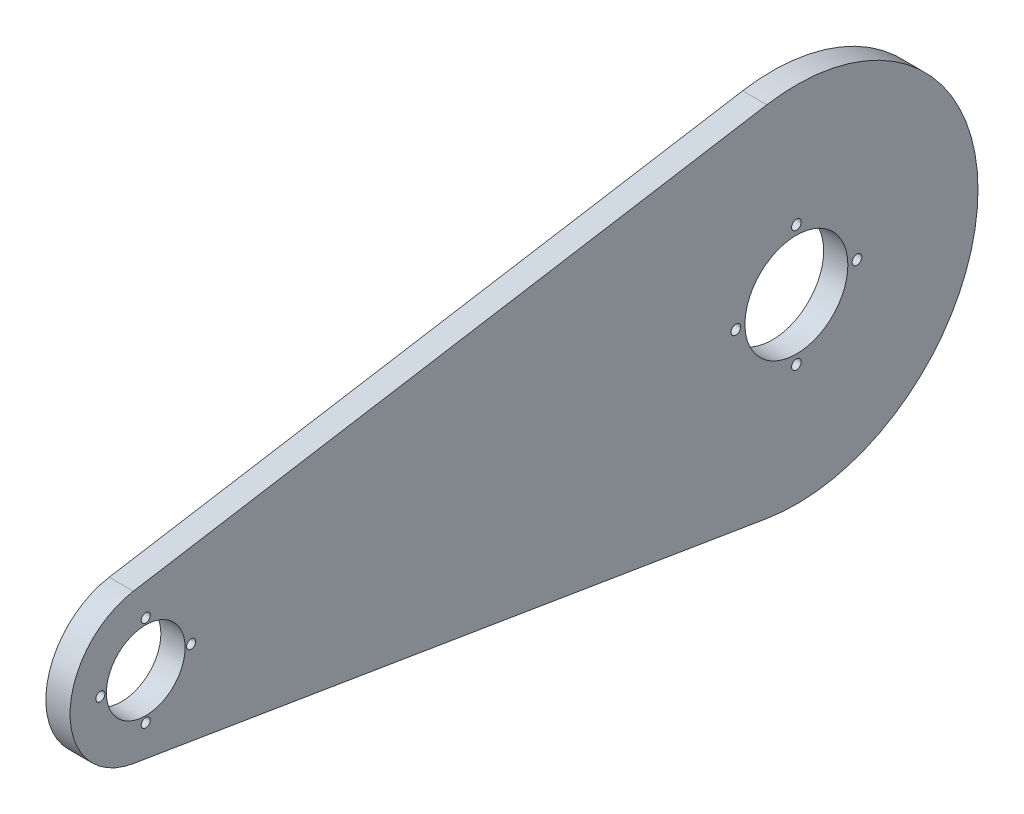
ISO-10303-21;
HEADER;
FILE_DESCRIPTION(('STEP AP214'),'2;1');
FILE_NAME('part.step','',(''),(''),'','','');
FILE_SCHEMA(('AUTOMOTIVE_DESIGN { 1 0 10303 214 1 1 1 1 }'));
ENDSEC;
DATA;
#1=APPLICATION_CONTEXT('core data for automotive mechanical design processes');
#2=APPLICATION_PROTOCOL_DEFINITION('international standard','automotive_design',2000,#1);
#3=PRODUCT_CONTEXT('',#1,'mechanical');
#4=PRODUCT('Part','Part','',(#3));
#5=PRODUCT_RELATED_PRODUCT_CATEGORY('part','',(#4));
#6=PRODUCT_DEFINITION_FORMATION('','',#4);
#7=PRODUCT_DEFINITION_CONTEXT('part definition',#1,'design');
#8=PRODUCT_DEFINITION('design','',#6,#7);
#9=PRODUCT_DEFINITION_SHAPE('','',#8);
#10=(LENGTH_UNIT() NAMED_UNIT(*) SI_UNIT(.MILLI.,.METRE.));
#11=(NAMED_UNIT(*) PLANE_ANGLE_UNIT() SI_UNIT($,.RADIAN.));
#12=(NAMED_UNIT(*) SI_UNIT($,.STERADIAN.) SOLID_ANGLE_UNIT());
#13=UNCERTAINTY_MEASURE_WITH_UNIT(LENGTH_MEASURE(1.E-05),#10,'distance_accuracy_value','');
#14=(GEOMETRIC_REPRESENTATION_CONTEXT(3) GLOBAL_UNCERTAINTY_ASSIGNED_CONTEXT((#13)) GLOBAL_UNIT_ASSIGNED_CONTEXT((#10,
#11,#12)) REPRESENTATION_CONTEXT('',''));
#15=CARTESIAN_POINT('',(0.,0.,0.));
#16=DIRECTION('',(0.,0.,1.));
#17=DIRECTION('',(1.,0.,0.));
#18=AXIS2_PLACEMENT_3D('',#15,#16,#17);
#19=CARTESIAN_POINT('',(4.,0.,215.));
#20=DIRECTION('',(1.,0.,0.));
#21=DIRECTION('',(0.,0.,-1.));
#22=AXIS2_PLACEMENT_3D('',#19,#20,#21);
#23=PLANE('',#22);
#24=CARTESIAN_POINT('',(4.,20.,0.));
#25=DIRECTION('',(1.,0.,0.));
#26=DIRECTION('',(0.,0.,-1.));
#27=AXIS2_PLACEMENT_3D('',#24,#25,#26);
#28=CIRCLE('',#27,1.6);
#29=CARTESIAN_POINT('',(4.,20.,-1.6));
#30=VERTEX_POINT('',#29);
#31=EDGE_CURVE('E158',#30,#30,#28,.T.);
#32=ORIENTED_EDGE('',*,*,#31,.F.);
#33=EDGE_LOOP('',(#32));
#34=FACE_BOUND('',#33,.T.);
#35=CARTESIAN_POINT('',(4.,0.,230.));
#36=DIRECTION('',(1.,0.,0.));
#37=DIRECTION('',(0.,0.,-1.));
#38=AXIS2_PLACEMENT_3D('',#35,#36,#37);
#39=CIRCLE('',#38,1.49999999999999);
#40=CARTESIAN_POINT('',(4.,0.,228.5));
#41=VERTEX_POINT('',#40);
#42=EDGE_CURVE('E162',#41,#41,#39,.T.);
#43=ORIENTED_EDGE('',*,*,#42,.F.);
#44=EDGE_LOOP('',(#43));
#45=FACE_BOUND('',#44,.T.);
#46=CARTESIAN_POINT('',(4.,-15.,215.));
#47=DIRECTION('',(1.,0.,0.));
#48=DIRECTION('',(0.,0.,-1.));
#49=AXIS2_PLACEMENT_3D('',#46,#47,#48);
#50=CIRCLE('',#49,1.5);
#51=CARTESIAN_POINT('',(4.,-15.,213.5));
#52=VERTEX_POINT('',#51);
#53=EDGE_CURVE('E168',#52,#52,#50,.T.);
#54=ORIENTED_EDGE('',*,*,#53,.F.);
#55=EDGE_LOOP('',(#54));
#56=FACE_BOUND('',#55,.T.);
#57=CARTESIAN_POINT('',(4.,1.38777878078145E-13,200.));
#58=DIRECTION('',(1.,0.,0.));
#59=DIRECTION('',(0.,0.,-1.));
#60=AXIS2_PLACEMENT_3D('',#57,#58,#59);
#61=CIRCLE('',#60,1.49999999999999);
#62=CARTESIAN_POINT('',(4.,1.38777878078145E-13,198.5));
#63=VERTEX_POINT('',#62);
#64=EDGE_CURVE('E137',#63,#63,#61,.T.);
#65=ORIENTED_EDGE('',*,*,#64,.F.);
#66=EDGE_LOOP('',(#65));
#67=FACE_BOUND('',#66,.T.);
#68=CARTESIAN_POINT('',(4.,15.,215.));
#69=DIRECTION('',(1.,0.,0.));
#70=DIRECTION('',(0.,0.,-1.));
#71=AXIS2_PLACEMENT_3D('',#68,#69,#70);
#72=CIRCLE('',#71,1.5);
#73=CARTESIAN_POINT('',(4.,15.,213.5));
#74=VERTEX_POINT('',#73);
#75=EDGE_CURVE('E136',#74,#74,#72,.T.);
#76=ORIENTED_EDGE('',*,*,#75,.F.);
#77=EDGE_LOOP('',(#76));
#78=FACE_BOUND('',#77,.T.);
#79=CARTESIAN_POINT('',(4.,0.,20.));
#80=DIRECTION('',(1.,0.,0.));
#81=DIRECTION('',(0.,0.,-1.));
#82=AXIS2_PLACEMENT_3D('',#79,#80,#81);
#83=CIRCLE('',#82,1.6);
#84=CARTESIAN_POINT('',(4.,0.,18.4));
#85=VERTEX_POINT('',#84);
#86=EDGE_CURVE('E143',#85,#85,#83,.T.);
#87=ORIENTED_EDGE('',*,*,#86,.F.);
#88=EDGE_LOOP('',(#87));
#89=FACE_BOUND('',#88,.T.);
#90=CARTESIAN_POINT('',(4.,-20.,0.));
#91=DIRECTION('',(1.,0.,0.));
#92=DIRECTION('',(0.,0.,-1.));
#93=AXIS2_PLACEMENT_3D('',#90,#91,#92);
#94=CIRCLE('',#93,1.6);
#95=CARTESIAN_POINT('',(4.,-20.,-1.6));
#96=VERTEX_POINT('',#95);
#97=EDGE_CURVE('E149',#96,#96,#94,.T.);
#98=ORIENTED_EDGE('',*,*,#97,.F.);
#99=EDGE_LOOP('',(#98));
#100=FACE_BOUND('',#99,.T.);
#101=CARTESIAN_POINT('',(4.,0.,-20.));
#102=DIRECTION('',(1.,0.,0.));
#103=DIRECTION('',(0.,0.,-1.));
#104=AXIS2_PLACEMENT_3D('',#101,#102,#103);
#105=CIRCLE('',#104,1.6);
#106=CARTESIAN_POINT('',(4.,0.,-21.6));
#107=VERTEX_POINT('',#106);
#108=EDGE_CURVE('E155',#107,#107,#105,.T.);
#109=ORIENTED_EDGE('',*,*,#108,.F.);
#110=EDGE_LOOP('',(#109));
#111=FACE_BOUND('',#110,.T.);
#112=CARTESIAN_POINT('',(4.,0.,0.));
#113=DIRECTION('',(1.,0.,0.));
#114=DIRECTION('',(0.,0.,-1.));
#115=AXIS2_PLACEMENT_3D('',#112,#113,#114);
#116=CIRCLE('',#115,17.);
#117=CARTESIAN_POINT('',(4.,0.,-17.));
#118=VERTEX_POINT('',#117);
#119=EDGE_CURVE('E109',#118,#118,#116,.T.);
#120=ORIENTED_EDGE('',*,*,#119,.F.);
#121=EDGE_LOOP('',(#120));
#122=FACE_BOUND('',#121,.T.);
#123=CARTESIAN_POINT('',(4.,0.,215.));
#124=DIRECTION('',(1.,0.,0.));
#125=DIRECTION('',(0.,0.,-1.));
#126=AXIS2_PLACEMENT_3D('',#123,#124,#125);
#127=CIRCLE('',#126,25.);
#128=CARTESIAN_POINT('',(4.,24.6665156227865,219.06976744186));
#129=VERTEX_POINT('',#128);
#130=CARTESIAN_POINT('',(4.,-24.6665156227866,219.06976744186));
#131=VERTEX_POINT('',#130);
#132=EDGE_CURVE('E94',#129,#131,#127,.T.);
#133=ORIENTED_EDGE('',*,*,#132,.T.);
#134=DIRECTION('',(0.,-0.162790697674419,-0.986660624911462));
#135=VECTOR('',#134,1.);
#136=CARTESIAN_POINT('',(4.,-24.6665156227866,219.06976744186));
#137=LINE('',#136,#135);
#138=CARTESIAN_POINT('',(4.,-59.1996374946877,9.76744186046514));
#139=VERTEX_POINT('',#138);
#140=EDGE_CURVE('E89',#131,#139,#137,.T.);
#141=ORIENTED_EDGE('',*,*,#140,.T.);
#142=CARTESIAN_POINT('',(4.,0.,0.));
#143=DIRECTION('',(1.,0.,0.));
#144=DIRECTION('',(0.,0.,-1.));
#145=AXIS2_PLACEMENT_3D('',#142,#143,#144);
#146=CIRCLE('',#145,60.);
#147=CARTESIAN_POINT('',(4.,59.1996374946877,9.76744186046512));
#148=VERTEX_POINT('',#147);
#149=EDGE_CURVE('E92',#139,#148,#146,.T.);
#150=ORIENTED_EDGE('',*,*,#149,.T.);
#151=DIRECTION('',(0.,-0.162790697674419,0.986660624911462));
#152=VECTOR('',#151,1.);
#153=CARTESIAN_POINT('',(4.,24.6665156227865,219.06976744186));
#154=LINE('',#153,#152);
#155=EDGE_CURVE('E59',#148,#129,#154,.T.);
#156=ORIENTED_EDGE('',*,*,#155,.T.);
#157=EDGE_LOOP('',(#133,#141,#150,#156));
#158=FACE_BOUND('',#157,.T.);
#159=CARTESIAN_POINT('',(4.,0.,215.));
#160=DIRECTION('',(1.,0.,0.));
#161=DIRECTION('',(0.,0.,-1.));
#162=AXIS2_PLACEMENT_3D('',#159,#160,#161);
#163=CIRCLE('',#162,13.);
#164=CARTESIAN_POINT('',(4.,0.,202.));
#165=VERTEX_POINT('',#164);
#166=EDGE_CURVE('E124',#165,#165,#163,.T.);
#167=ORIENTED_EDGE('',*,*,#166,.F.);
#168=EDGE_LOOP('',(#167));
#169=FACE_BOUND('',#168,.T.);
#170=ADVANCED_FACE('F42',(#34,#45,#56,#67,#78,#89,#100,#111,#122,#158,#169),#23,.T.);
#171=CARTESIAN_POINT('',(-4.,0.,215.));
#172=DIRECTION('',(1.,0.,0.));
#173=DIRECTION('',(0.,0.,-1.));
#174=AXIS2_PLACEMENT_3D('',#171,#172,#173);
#175=PLANE('',#174);
#176=CARTESIAN_POINT('',(-4.,20.,0.));
#177=DIRECTION('',(1.,0.,0.));
#178=DIRECTION('',(0.,0.,-1.));
#179=AXIS2_PLACEMENT_3D('',#176,#177,#178);
#180=CIRCLE('',#179,1.6);
#181=CARTESIAN_POINT('',(-4.,20.,-1.6));
#182=VERTEX_POINT('',#181);
#183=EDGE_CURVE('E130',#182,#182,#180,.T.);
#184=ORIENTED_EDGE('',*,*,#183,.T.);
#185=EDGE_LOOP('',(#184));
#186=FACE_BOUND('',#185,.T.);
#187=CARTESIAN_POINT('',(-4.,0.,230.));
#188=DIRECTION('',(1.,0.,0.));
#189=DIRECTION('',(0.,0.,-1.));
#190=AXIS2_PLACEMENT_3D('',#187,#188,#189);
#191=CIRCLE('',#190,1.49999999999999);
#192=CARTESIAN_POINT('',(-4.,0.,228.5));
#193=VERTEX_POINT('',#192);
#194=EDGE_CURVE('E159',#193,#193,#191,.T.);
#195=ORIENTED_EDGE('',*,*,#194,.T.);
#196=EDGE_LOOP('',(#195));
#197=FACE_BOUND('',#196,.T.);
#198=CARTESIAN_POINT('',(-4.,-15.,215.));
#199=DIRECTION('',(1.,0.,0.));
#200=DIRECTION('',(0.,0.,-1.));
#201=AXIS2_PLACEMENT_3D('',#198,#199,#200);
#202=CIRCLE('',#201,1.5);
#203=CARTESIAN_POINT('',(-4.,-15.,213.5));
#204=VERTEX_POINT('',#203);
#205=EDGE_CURVE('E165',#204,#204,#202,.T.);
#206=ORIENTED_EDGE('',*,*,#205,.T.);
#207=EDGE_LOOP('',(#206));
#208=FACE_BOUND('',#207,.T.);
#209=CARTESIAN_POINT('',(-4.,1.38777878078145E-13,200.));
#210=DIRECTION('',(1.,0.,0.));
#211=DIRECTION('',(0.,0.,-1.));
#212=AXIS2_PLACEMENT_3D('',#209,#210,#211);
#213=CIRCLE('',#212,1.49999999999999);
#214=CARTESIAN_POINT('',(-4.,1.38777878078145E-13,198.5));
#215=VERTEX_POINT('',#214);
#216=EDGE_CURVE('E171',#215,#215,#213,.T.);
#217=ORIENTED_EDGE('',*,*,#216,.T.);
#218=EDGE_LOOP('',(#217));
#219=FACE_BOUND('',#218,.T.);
#220=CARTESIAN_POINT('',(-4.,15.,215.));
#221=DIRECTION('',(1.,0.,0.));
#222=DIRECTION('',(0.,0.,-1.));
#223=AXIS2_PLACEMENT_3D('',#220,#221,#222);
#224=CIRCLE('',#223,1.5);
#225=CARTESIAN_POINT('',(-4.,15.,213.5));
#226=VERTEX_POINT('',#225);
#227=EDGE_CURVE('E133',#226,#226,#224,.T.);
#228=ORIENTED_EDGE('',*,*,#227,.T.);
#229=EDGE_LOOP('',(#228));
#230=FACE_BOUND('',#229,.T.);
#231=CARTESIAN_POINT('',(-4.,0.,20.));
#232=DIRECTION('',(1.,0.,0.));
#233=DIRECTION('',(0.,0.,-1.));
#234=AXIS2_PLACEMENT_3D('',#231,#232,#233);
#235=CIRCLE('',#234,1.6);
#236=CARTESIAN_POINT('',(-4.,0.,18.4));
#237=VERTEX_POINT('',#236);
#238=EDGE_CURVE('E140',#237,#237,#235,.T.);
#239=ORIENTED_EDGE('',*,*,#238,.T.);
#240=EDGE_LOOP('',(#239));
#241=FACE_BOUND('',#240,.T.);
#242=CARTESIAN_POINT('',(-4.,-20.,0.));
#243=DIRECTION('',(1.,0.,0.));
#244=DIRECTION('',(0.,0.,-1.));
#245=AXIS2_PLACEMENT_3D('',#242,#243,#244);
#246=CIRCLE('',#245,1.6);
#247=CARTESIAN_POINT('',(-4.,-20.,-1.6));
#248=VERTEX_POINT('',#247);
#249=EDGE_CURVE('E146',#248,#248,#246,.T.);
#250=ORIENTED_EDGE('',*,*,#249,.T.);
#251=EDGE_LOOP('',(#250));
#252=FACE_BOUND('',#251,.T.);
#253=CARTESIAN_POINT('',(-4.,0.,-20.));
#254=DIRECTION('',(1.,0.,0.));
#255=DIRECTION('',(0.,0.,-1.));
#256=AXIS2_PLACEMENT_3D('',#253,#254,#255);
#257=CIRCLE('',#256,1.6);
#258=CARTESIAN_POINT('',(-4.,0.,-21.6));
#259=VERTEX_POINT('',#258);
#260=EDGE_CURVE('E152',#259,#259,#257,.T.);
#261=ORIENTED_EDGE('',*,*,#260,.T.);
#262=EDGE_LOOP('',(#261));
#263=FACE_BOUND('',#262,.T.);
#264=CARTESIAN_POINT('',(-4.,0.,215.));
#265=DIRECTION('',(1.,0.,0.));
#266=DIRECTION('',(0.,0.,-1.));
#267=AXIS2_PLACEMENT_3D('',#264,#265,#266);
#268=CIRCLE('',#267,25.);
#269=CARTESIAN_POINT('',(-4.,24.6665156227865,219.06976744186));
#270=VERTEX_POINT('',#269);
#271=CARTESIAN_POINT('',(-4.,-24.6665156227866,219.06976744186));
#272=VERTEX_POINT('',#271);
#273=EDGE_CURVE('E106',#270,#272,#268,.T.);
#274=ORIENTED_EDGE('',*,*,#273,.F.);
#275=DIRECTION('',(0.,-0.162790697674419,0.986660624911462));
#276=VECTOR('',#275,1.);
#277=CARTESIAN_POINT('',(-4.,24.6665156227865,219.06976744186));
#278=LINE('',#277,#276);
#279=CARTESIAN_POINT('',(-4.,59.1996374946877,9.76744186046512));
#280=VERTEX_POINT('',#279);
#281=EDGE_CURVE('E82',#280,#270,#278,.T.);
#282=ORIENTED_EDGE('',*,*,#281,.F.);
#283=CARTESIAN_POINT('',(-4.,0.,0.));
#284=DIRECTION('',(1.,0.,0.));
#285=DIRECTION('',(0.,0.,-1.));
#286=AXIS2_PLACEMENT_3D('',#283,#284,#285);
#287=CIRCLE('',#286,60.);
#288=CARTESIAN_POINT('',(-4.,-59.1996374946877,9.76744186046514));
#289=VERTEX_POINT('',#288);
#290=EDGE_CURVE('E76',#289,#280,#287,.T.);
#291=ORIENTED_EDGE('',*,*,#290,.F.);
#292=DIRECTION('',(0.,-0.162790697674419,-0.986660624911462));
#293=VECTOR('',#292,1.);
#294=CARTESIAN_POINT('',(-4.,-24.6665156227866,219.06976744186));
#295=LINE('',#294,#293);
#296=EDGE_CURVE('E98',#272,#289,#295,.T.);
#297=ORIENTED_EDGE('',*,*,#296,.F.);
#298=EDGE_LOOP('',(#274,#282,#291,#297));
#299=FACE_BOUND('',#298,.T.);
#300=CARTESIAN_POINT('',(-4.,0.,0.));
#301=DIRECTION('',(1.,0.,0.));
#302=DIRECTION('',(0.,0.,-1.));
#303=AXIS2_PLACEMENT_3D('',#300,#301,#302);
#304=CIRCLE('',#303,17.);
#305=CARTESIAN_POINT('',(-4.,0.,-17.));
#306=VERTEX_POINT('',#305);
#307=EDGE_CURVE('E121',#306,#306,#304,.T.);
#308=ORIENTED_EDGE('',*,*,#307,.T.);
#309=EDGE_LOOP('',(#308));
#310=FACE_BOUND('',#309,.T.);
#311=CARTESIAN_POINT('',(-4.,0.,215.));
#312=DIRECTION('',(1.,0.,0.));
#313=DIRECTION('',(0.,0.,-1.));
#314=AXIS2_PLACEMENT_3D('',#311,#312,#313);
#315=CIRCLE('',#314,13.);
#316=CARTESIAN_POINT('',(-4.,0.,202.));
#317=VERTEX_POINT('',#316);
#318=EDGE_CURVE('E127',#317,#317,#315,.T.);
#319=ORIENTED_EDGE('',*,*,#318,.T.);
#320=EDGE_LOOP('',(#319));
#321=FACE_BOUND('',#320,.T.);
#322=ADVANCED_FACE('F117',(#186,#197,#208,#219,#230,#241,#252,#263,#299,#310,#321),#175,.F.);
#323=CARTESIAN_POINT('',(4.,0.,215.));
#324=DIRECTION('',(-1.,0.,0.));
#325=DIRECTION('',(0.,0.,1.));
#326=AXIS2_PLACEMENT_3D('',#323,#324,#325);
#327=CYLINDRICAL_SURFACE('',#326,25.);
#328=ORIENTED_EDGE('',*,*,#273,.T.);
#329=DIRECTION('',(-1.,0.,0.));
#330=VECTOR('',#329,1.);
#331=CARTESIAN_POINT('',(4.,-24.6665156227866,219.06976744186));
#332=LINE('',#331,#330);
#333=EDGE_CURVE('E11',#131,#272,#332,.T.);
#334=ORIENTED_EDGE('',*,*,#333,.F.);
#335=ORIENTED_EDGE('',*,*,#132,.F.);
#336=DIRECTION('',(-1.,0.,0.));
#337=VECTOR('',#336,1.);
#338=CARTESIAN_POINT('',(4.,24.6665156227865,219.06976744186));
#339=LINE('',#338,#337);
#340=EDGE_CURVE('E102',#129,#270,#339,.T.);
#341=ORIENTED_EDGE('',*,*,#340,.T.);
#342=EDGE_LOOP('',(#328,#334,#335,#341));
#343=FACE_BOUND('',#342,.T.);
#344=ADVANCED_FACE('F44',(#343),#327,.T.);
#345=CARTESIAN_POINT('',(4.,-24.6665156227866,219.06976744186));
#346=DIRECTION('',(0.,0.986660624911462,-0.162790697674418));
#347=DIRECTION('',(0.,0.162790697674418,0.986660624911462));
#348=AXIS2_PLACEMENT_3D('',#345,#346,#347);
#349=PLANE('',#348);
#350=ORIENTED_EDGE('',*,*,#296,.T.);
#351=DIRECTION('',(-1.,0.,0.));
#352=VECTOR('',#351,1.);
#353=CARTESIAN_POINT('',(4.,-59.1996374946877,9.76744186046514));
#354=LINE('',#353,#352);
#355=EDGE_CURVE('E51',#139,#289,#354,.T.);
#356=ORIENTED_EDGE('',*,*,#355,.F.);
#357=ORIENTED_EDGE('',*,*,#140,.F.);
#358=ORIENTED_EDGE('',*,*,#333,.T.);
#359=EDGE_LOOP('',(#350,#356,#357,#358));
#360=FACE_BOUND('',#359,.T.);
#361=ADVANCED_FACE('F97',(#360),#349,.F.);
#362=CARTESIAN_POINT('',(4.,0.,0.));
#363=DIRECTION('',(-1.,0.,0.));
#364=DIRECTION('',(0.,0.,1.));
#365=AXIS2_PLACEMENT_3D('',#362,#363,#364);
#366=CYLINDRICAL_SURFACE('',#365,60.);
#367=ORIENTED_EDGE('',*,*,#290,.T.);
#368=DIRECTION('',(-1.,0.,0.));
#369=VECTOR('',#368,1.);
#370=CARTESIAN_POINT('',(4.,59.1996374946877,9.76744186046512));
#371=LINE('',#370,#369);
#372=EDGE_CURVE('E99',#148,#280,#371,.T.);
#373=ORIENTED_EDGE('',*,*,#372,.F.);
#374=ORIENTED_EDGE('',*,*,#149,.F.);
#375=ORIENTED_EDGE('',*,*,#355,.T.);
#376=EDGE_LOOP('',(#367,#373,#374,#375));
#377=FACE_BOUND('',#376,.T.);
#378=ADVANCED_FACE('F100',(#377),#366,.T.);
#379=CARTESIAN_POINT('',(4.,24.6665156227865,219.06976744186));
#380=DIRECTION('',(0.,-0.986660624911462,-0.162790697674419));
#381=DIRECTION('',(0.,0.162790697674419,-0.986660624911462));
#382=AXIS2_PLACEMENT_3D('',#379,#380,#381);
#383=PLANE('',#382);
#384=ORIENTED_EDGE('',*,*,#281,.T.);
#385=ORIENTED_EDGE('',*,*,#340,.F.);
#386=ORIENTED_EDGE('',*,*,#155,.F.);
#387=ORIENTED_EDGE('',*,*,#372,.T.);
#388=EDGE_LOOP('',(#384,#385,#386,#387));
#389=FACE_BOUND('',#388,.T.);
#390=ADVANCED_FACE('F114',(#389),#383,.F.);
#391=CARTESIAN_POINT('',(4.,0.,0.));
#392=DIRECTION('',(-1.,0.,0.));
#393=DIRECTION('',(0.,0.,1.));
#394=AXIS2_PLACEMENT_3D('',#391,#392,#393);
#395=CYLINDRICAL_SURFACE('',#394,17.);
#396=ORIENTED_EDGE('',*,*,#119,.T.);
#397=EDGE_LOOP('',(#396));
#398=FACE_BOUND('',#397,.T.);
#399=ORIENTED_EDGE('',*,*,#307,.F.);
#400=EDGE_LOOP('',(#399));
#401=FACE_BOUND('',#400,.T.);
#402=ADVANCED_FACE('F209',(#398,#401),#395,.F.);
#403=CARTESIAN_POINT('',(4.,0.,215.));
#404=DIRECTION('',(-1.,0.,0.));
#405=DIRECTION('',(0.,0.,1.));
#406=AXIS2_PLACEMENT_3D('',#403,#404,#405);
#407=CYLINDRICAL_SURFACE('',#406,13.);
#408=ORIENTED_EDGE('',*,*,#166,.T.);
#409=EDGE_LOOP('',(#408));
#410=FACE_BOUND('',#409,.T.);
#411=ORIENTED_EDGE('',*,*,#318,.F.);
#412=EDGE_LOOP('',(#411));
#413=FACE_BOUND('',#412,.T.);
#414=ADVANCED_FACE('F212',(#410,#413),#407,.F.);
#415=CARTESIAN_POINT('',(-4.,0.,-20.));
#416=DIRECTION('',(1.,0.,0.));
#417=DIRECTION('',(0.,0.,-1.));
#418=AXIS2_PLACEMENT_3D('',#415,#416,#417);
#419=CYLINDRICAL_SURFACE('',#418,1.6);
#420=ORIENTED_EDGE('',*,*,#260,.F.);
#421=EDGE_LOOP('',(#420));
#422=FACE_BOUND('',#421,.T.);
#423=ORIENTED_EDGE('',*,*,#108,.T.);
#424=EDGE_LOOP('',(#423));
#425=FACE_BOUND('',#424,.T.);
#426=ADVANCED_FACE('F221',(#422,#425),#419,.F.);
#427=CARTESIAN_POINT('',(-4.,-20.,0.));
#428=DIRECTION('',(1.,0.,0.));
#429=DIRECTION('',(0.,0.,-1.));
#430=AXIS2_PLACEMENT_3D('',#427,#428,#429);
#431=CYLINDRICAL_SURFACE('',#430,1.6);
#432=ORIENTED_EDGE('',*,*,#249,.F.);
#433=EDGE_LOOP('',(#432));
#434=FACE_BOUND('',#433,.T.);
#435=ORIENTED_EDGE('',*,*,#97,.T.);
#436=EDGE_LOOP('',(#435));
#437=FACE_BOUND('',#436,.T.);
#438=ADVANCED_FACE('F227',(#434,#437),#431,.F.);
#439=CARTESIAN_POINT('',(-4.,0.,20.));
#440=DIRECTION('',(1.,0.,0.));
#441=DIRECTION('',(0.,0.,-1.));
#442=AXIS2_PLACEMENT_3D('',#439,#440,#441);
#443=CYLINDRICAL_SURFACE('',#442,1.6);
#444=ORIENTED_EDGE('',*,*,#238,.F.);
#445=EDGE_LOOP('',(#444));
#446=FACE_BOUND('',#445,.T.);
#447=ORIENTED_EDGE('',*,*,#86,.T.);
#448=EDGE_LOOP('',(#447));
#449=FACE_BOUND('',#448,.T.);
#450=ADVANCED_FACE('F277',(#446,#449),#443,.F.);
#451=CARTESIAN_POINT('',(-4.,15.,215.));
#452=DIRECTION('',(1.,0.,0.));
#453=DIRECTION('',(0.,0.,-1.));
#454=AXIS2_PLACEMENT_3D('',#451,#452,#453);
#455=CYLINDRICAL_SURFACE('',#454,1.5);
#456=ORIENTED_EDGE('',*,*,#227,.F.);
#457=EDGE_LOOP('',(#456));
#458=FACE_BOUND('',#457,.T.);
#459=ORIENTED_EDGE('',*,*,#75,.T.);
#460=EDGE_LOOP('',(#459));
#461=FACE_BOUND('',#460,.T.);
#462=ADVANCED_FACE('F231',(#458,#461),#455,.F.);
#463=CARTESIAN_POINT('',(-4.,1.38777878078145E-13,200.));
#464=DIRECTION('',(1.,0.,0.));
#465=DIRECTION('',(0.,0.,-1.));
#466=AXIS2_PLACEMENT_3D('',#463,#464,#465);
#467=CYLINDRICAL_SURFACE('',#466,1.49999999999999);
#468=ORIENTED_EDGE('',*,*,#216,.F.);
#469=EDGE_LOOP('',(#468));
#470=FACE_BOUND('',#469,.T.);
#471=ORIENTED_EDGE('',*,*,#64,.T.);
#472=EDGE_LOOP('',(#471));
#473=FACE_BOUND('',#472,.T.);
#474=ADVANCED_FACE('F293',(#470,#473),#467,.F.);
#475=CARTESIAN_POINT('',(-4.,-15.,215.));
#476=DIRECTION('',(1.,0.,0.));
#477=DIRECTION('',(0.,0.,-1.));
#478=AXIS2_PLACEMENT_3D('',#475,#476,#477);
#479=CYLINDRICAL_SURFACE('',#478,1.5);
#480=ORIENTED_EDGE('',*,*,#205,.F.);
#481=EDGE_LOOP('',(#480));
#482=FACE_BOUND('',#481,.T.);
#483=ORIENTED_EDGE('',*,*,#53,.T.);
#484=EDGE_LOOP('',(#483));
#485=FACE_BOUND('',#484,.T.);
#486=ADVANCED_FACE('F301',(#482,#485),#479,.F.);
#487=CARTESIAN_POINT('',(-4.,0.,230.));
#488=DIRECTION('',(1.,0.,0.));
#489=DIRECTION('',(0.,0.,-1.));
#490=AXIS2_PLACEMENT_3D('',#487,#488,#489);
#491=CYLINDRICAL_SURFACE('',#490,1.49999999999999);
#492=ORIENTED_EDGE('',*,*,#194,.F.);
#493=EDGE_LOOP('',(#492));
#494=FACE_BOUND('',#493,.T.);
#495=ORIENTED_EDGE('',*,*,#42,.T.);
#496=EDGE_LOOP('',(#495));
#497=FACE_BOUND('',#496,.T.);
#498=ADVANCED_FACE('F186',(#494,#497),#491,.F.);
#499=CARTESIAN_POINT('',(-4.,20.,0.));
#500=DIRECTION('',(1.,0.,0.));
#501=DIRECTION('',(0.,0.,-1.));
#502=AXIS2_PLACEMENT_3D('',#499,#500,#501);
#503=CYLINDRICAL_SURFACE('',#502,1.6);
#504=ORIENTED_EDGE('',*,*,#183,.F.);
#505=EDGE_LOOP('',(#504));
#506=FACE_BOUND('',#505,.T.);
#507=ORIENTED_EDGE('',*,*,#31,.T.);
#508=EDGE_LOOP('',(#507));
#509=FACE_BOUND('',#508,.T.);
#510=ADVANCED_FACE('F183',(#506,#509),#503,.F.);
#511=CLOSED_SHELL('',(#170,#322,#344,#361,#378,#390,#402,#414,#426,#438,#450,#462,#474,#486,
#498,#510));
#512=MANIFOLD_SOLID_BREP('B2',#511);
#513=ADVANCED_BREP_SHAPE_REPRESENTATION('',(#18,#512),#14);
#514=SHAPE_DEFINITION_REPRESENTATION(#9,#513);
ENDSEC;
END-ISO-10303-21;
